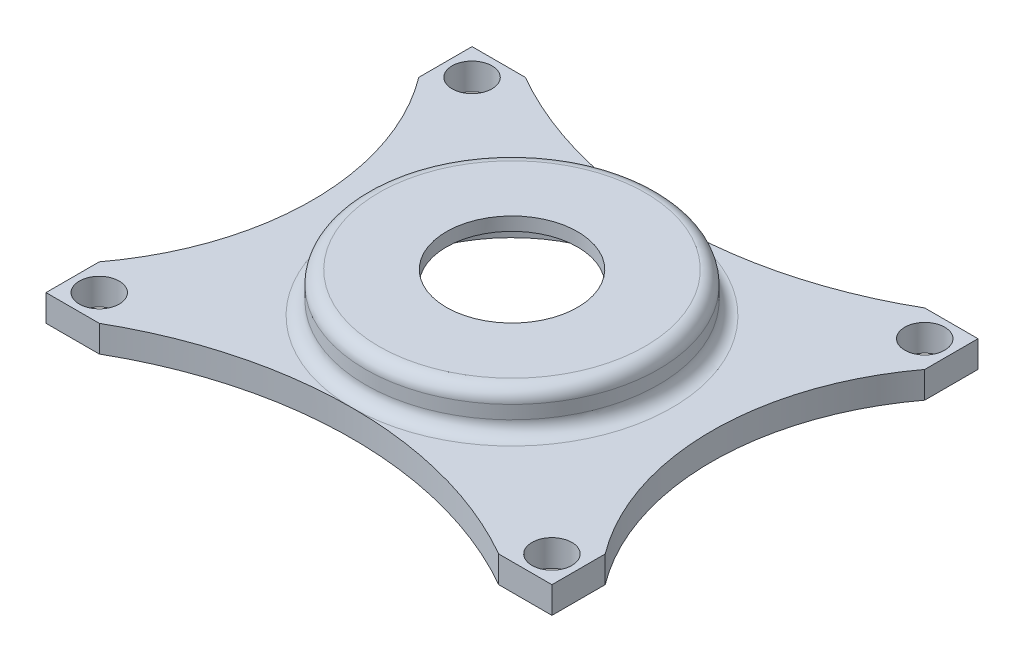
ISO-10303-21;
HEADER;
FILE_DESCRIPTION(('STEP AP214'),'2;1');
FILE_NAME('part.step','',(''),(''),'','','');
FILE_SCHEMA(('AUTOMOTIVE_DESIGN { 1 0 10303 214 1 1 1 1 }'));
ENDSEC;
DATA;
#1=APPLICATION_CONTEXT('core data for automotive mechanical design processes');
#2=APPLICATION_PROTOCOL_DEFINITION('international standard','automotive_design',2000,#1);
#3=PRODUCT_CONTEXT('',#1,'mechanical');
#4=PRODUCT('Part','Part','',(#3));
#5=PRODUCT_RELATED_PRODUCT_CATEGORY('part','',(#4));
#6=PRODUCT_DEFINITION_FORMATION('','',#4);
#7=PRODUCT_DEFINITION_CONTEXT('part definition',#1,'design');
#8=PRODUCT_DEFINITION('design','',#6,#7);
#9=PRODUCT_DEFINITION_SHAPE('','',#8);
#10=(LENGTH_UNIT() NAMED_UNIT(*) SI_UNIT(.MILLI.,.METRE.));
#11=(NAMED_UNIT(*) PLANE_ANGLE_UNIT() SI_UNIT($,.RADIAN.));
#12=(NAMED_UNIT(*) SI_UNIT($,.STERADIAN.) SOLID_ANGLE_UNIT());
#13=UNCERTAINTY_MEASURE_WITH_UNIT(LENGTH_MEASURE(1.E-05),#10,'distance_accuracy_value','');
#14=(GEOMETRIC_REPRESENTATION_CONTEXT(3) GLOBAL_UNCERTAINTY_ASSIGNED_CONTEXT((#13)) GLOBAL_UNIT_ASSIGNED_CONTEXT((#10,
#11,#12)) REPRESENTATION_CONTEXT('',''));
#15=CARTESIAN_POINT('',(0.,0.,0.));
#16=DIRECTION('',(0.,0.,1.));
#17=DIRECTION('',(1.,0.,0.));
#18=AXIS2_PLACEMENT_3D('',#15,#16,#17);
#19=CARTESIAN_POINT('',(0.,2.,0.));
#20=DIRECTION('',(0.,1.,0.));
#21=DIRECTION('',(0.,0.,1.));
#22=AXIS2_PLACEMENT_3D('',#19,#20,#21);
#23=CYLINDRICAL_SURFACE('',#22,4.92746606281714);
#24=CARTESIAN_POINT('',(0.,5.,0.));
#25=DIRECTION('',(0.,1.,0.));
#26=DIRECTION('',(0.,0.,1.));
#27=AXIS2_PLACEMENT_3D('',#24,#25,#26);
#28=CIRCLE('',#27,4.92746606281714);
#29=CARTESIAN_POINT('',(0.,5.,4.92746606281714));
#30=VERTEX_POINT('',#29);
#31=EDGE_CURVE('E170',#30,#30,#28,.T.);
#32=ORIENTED_EDGE('',*,*,#31,.T.);
#33=EDGE_LOOP('',(#32));
#34=FACE_BOUND('',#33,.T.);
#35=CARTESIAN_POINT('',(0.,4.,0.));
#36=DIRECTION('',(0.,-1.,0.));
#37=DIRECTION('',(0.,0.,-1.));
#38=AXIS2_PLACEMENT_3D('',#35,#36,#37);
#39=CIRCLE('',#38,4.92746606281714);
#40=CARTESIAN_POINT('',(0.,4.,-4.92746606281714));
#41=VERTEX_POINT('',#40);
#42=EDGE_CURVE('E168',#41,#41,#39,.F.);
#43=ORIENTED_EDGE('',*,*,#42,.F.);
#44=EDGE_LOOP('',(#43));
#45=FACE_BOUND('',#44,.T.);
#46=ADVANCED_FACE('F32',(#34,#45),#23,.F.);
#47=CARTESIAN_POINT('',(0.,3.,0.));
#48=DIRECTION('',(0.,-1.,0.));
#49=DIRECTION('',(0.,0.,-1.));
#50=AXIS2_PLACEMENT_3D('',#47,#48,#49);
#51=TOROIDAL_SURFACE('',#50,12.,1.);
#52=CARTESIAN_POINT('',(0.,3.,0.));
#53=DIRECTION('',(0.,-1.,0.));
#54=DIRECTION('',(0.,0.,-1.));
#55=AXIS2_PLACEMENT_3D('',#52,#53,#54);
#56=CIRCLE('',#55,11.);
#57=CARTESIAN_POINT('',(0.,3.,-11.));
#58=VERTEX_POINT('',#57);
#59=EDGE_CURVE('E162',#58,#58,#56,.F.);
#60=ORIENTED_EDGE('',*,*,#59,.F.);
#61=EDGE_LOOP('',(#60));
#62=FACE_BOUND('',#61,.T.);
#63=CARTESIAN_POINT('',(0.,2.,0.));
#64=DIRECTION('',(0.,-1.,0.));
#65=DIRECTION('',(0.,0.,-1.));
#66=AXIS2_PLACEMENT_3D('',#63,#64,#65);
#67=CIRCLE('',#66,12.);
#68=CARTESIAN_POINT('',(0.,2.,12.));
#69=VERTEX_POINT('',#68);
#70=CARTESIAN_POINT('',(0.,2.,-12.));
#71=VERTEX_POINT('',#70);
#72=EDGE_CURVE('E46',#69,#71,#67,.T.);
#73=ORIENTED_EDGE('',*,*,#72,.F.);
#74=CARTESIAN_POINT('',(0.,2.,0.));
#75=DIRECTION('',(0.,-1.,0.));
#76=DIRECTION('',(0.,0.,-1.));
#77=AXIS2_PLACEMENT_3D('',#74,#75,#76);
#78=CIRCLE('',#77,12.);
#79=EDGE_CURVE('E165',#71,#69,#78,.T.);
#80=ORIENTED_EDGE('',*,*,#79,.F.);
#81=EDGE_LOOP('',(#73,#80));
#82=FACE_BOUND('',#81,.T.);
#83=ADVANCED_FACE('F188',(#62,#82),#51,.F.);
#84=CARTESIAN_POINT('',(35.0000000000001,2.,0.));
#85=DIRECTION('',(0.,-1.,0.));
#86=DIRECTION('',(0.,0.,-1.));
#87=AXIS2_PLACEMENT_3D('',#84,#85,#86);
#88=PLANE('',#87);
#89=CARTESIAN_POINT('',(-17.,2.,-14.));
#90=DIRECTION('',(0.,1.,0.));
#91=DIRECTION('',(0.,0.,1.));
#92=AXIS2_PLACEMENT_3D('',#89,#90,#91);
#93=CIRCLE('',#92,1.5);
#94=CARTESIAN_POINT('',(-17.,2.,-12.5));
#95=VERTEX_POINT('',#94);
#96=EDGE_CURVE('E292',#95,#95,#93,.T.);
#97=ORIENTED_EDGE('',*,*,#96,.F.);
#98=EDGE_LOOP('',(#97));
#99=FACE_BOUND('',#98,.T.);
#100=CARTESIAN_POINT('',(-17.,2.,14.));
#101=DIRECTION('',(0.,1.,0.));
#102=DIRECTION('',(0.,0.,1.));
#103=AXIS2_PLACEMENT_3D('',#100,#101,#102);
#104=CIRCLE('',#103,1.5);
#105=CARTESIAN_POINT('',(-17.,2.,15.5));
#106=VERTEX_POINT('',#105);
#107=EDGE_CURVE('E295',#106,#106,#104,.T.);
#108=ORIENTED_EDGE('',*,*,#107,.F.);
#109=EDGE_LOOP('',(#108));
#110=FACE_BOUND('',#109,.T.);
#111=CARTESIAN_POINT('',(0.,2.,42.1250000000001));
#112=DIRECTION('',(0.,-1.,0.));
#113=DIRECTION('',(0.,0.,-1.));
#114=AXIS2_PLACEMENT_3D('',#111,#112,#113);
#115=CIRCLE('',#114,30.1250000000001);
#116=CARTESIAN_POINT('',(-15.,2.,16.));
#117=VERTEX_POINT('',#116);
#118=EDGE_CURVE('E297',#117,#69,#115,.T.);
#119=ORIENTED_EDGE('',*,*,#118,.T.);
#120=ORIENTED_EDGE('',*,*,#72,.T.);
#121=CARTESIAN_POINT('',(0.,2.,-42.1250000000001));
#122=DIRECTION('',(0.,-1.,0.));
#123=DIRECTION('',(0.,0.,-1.));
#124=AXIS2_PLACEMENT_3D('',#121,#122,#123);
#125=CIRCLE('',#124,30.1250000000001);
#126=CARTESIAN_POINT('',(-15.,2.,-16.));
#127=VERTEX_POINT('',#126);
#128=EDGE_CURVE('E370',#71,#127,#125,.T.);
#129=ORIENTED_EDGE('',*,*,#128,.T.);
#130=DIRECTION('',(-1.,0.,0.));
#131=VECTOR('',#130,1.);
#132=CARTESIAN_POINT('',(-19.,2.,-16.));
#133=LINE('',#132,#131);
#134=CARTESIAN_POINT('',(-19.,2.,-16.));
#135=VERTEX_POINT('',#134);
#136=EDGE_CURVE('E371',#127,#135,#133,.T.);
#137=ORIENTED_EDGE('',*,*,#136,.T.);
#138=DIRECTION('',(0.,0.,1.));
#139=VECTOR('',#138,1.);
#140=CARTESIAN_POINT('',(-19.,2.,-16.));
#141=LINE('',#140,#139);
#142=CARTESIAN_POINT('',(-19.,2.,-12.));
#143=VERTEX_POINT('',#142);
#144=EDGE_CURVE('E373',#135,#143,#141,.T.);
#145=ORIENTED_EDGE('',*,*,#144,.T.);
#146=CARTESIAN_POINT('',(-35.,2.,0.));
#147=DIRECTION('',(0.,-1.,0.));
#148=DIRECTION('',(0.,0.,-1.));
#149=AXIS2_PLACEMENT_3D('',#146,#147,#148);
#150=CIRCLE('',#149,20.);
#151=CARTESIAN_POINT('',(-19.,2.,12.));
#152=VERTEX_POINT('',#151);
#153=EDGE_CURVE('E380',#143,#152,#150,.T.);
#154=ORIENTED_EDGE('',*,*,#153,.T.);
#155=DIRECTION('',(0.,0.,1.));
#156=VECTOR('',#155,1.);
#157=CARTESIAN_POINT('',(-19.,2.,12.));
#158=LINE('',#157,#156);
#159=CARTESIAN_POINT('',(-19.,2.,16.));
#160=VERTEX_POINT('',#159);
#161=EDGE_CURVE('E381',#152,#160,#158,.T.);
#162=ORIENTED_EDGE('',*,*,#161,.T.);
#163=DIRECTION('',(1.,0.,0.));
#164=VECTOR('',#163,1.);
#165=CARTESIAN_POINT('',(-19.,2.,16.));
#166=LINE('',#165,#164);
#167=EDGE_CURVE('E299',#160,#117,#166,.T.);
#168=ORIENTED_EDGE('',*,*,#167,.T.);
#169=EDGE_LOOP('',(#119,#120,#129,#137,#145,#154,#162,#168));
#170=FACE_BOUND('',#169,.T.);
#171=ADVANCED_FACE('F194',(#99,#110,#170),#88,.F.);
#172=CARTESIAN_POINT('',(0.,4.,0.));
#173=DIRECTION('',(0.,1.,0.));
#174=DIRECTION('',(0.,0.,1.));
#175=AXIS2_PLACEMENT_3D('',#172,#173,#174);
#176=TOROIDAL_SURFACE('',#175,10.,1.);
#177=CARTESIAN_POINT('',(0.,5.,0.));
#178=DIRECTION('',(0.,1.,0.));
#179=DIRECTION('',(0.,0.,1.));
#180=AXIS2_PLACEMENT_3D('',#177,#178,#179);
#181=CIRCLE('',#180,10.);
#182=CARTESIAN_POINT('',(0.,5.,10.));
#183=VERTEX_POINT('',#182);
#184=EDGE_CURVE('E151',#183,#183,#181,.T.);
#185=ORIENTED_EDGE('',*,*,#184,.F.);
#186=EDGE_LOOP('',(#185));
#187=FACE_BOUND('',#186,.T.);
#188=CARTESIAN_POINT('',(0.,4.,0.));
#189=DIRECTION('',(0.,1.,0.));
#190=DIRECTION('',(0.,0.,1.));
#191=AXIS2_PLACEMENT_3D('',#188,#189,#190);
#192=CIRCLE('',#191,11.);
#193=CARTESIAN_POINT('',(0.,4.,11.));
#194=VERTEX_POINT('',#193);
#195=EDGE_CURVE('E154',#194,#194,#192,.F.);
#196=ORIENTED_EDGE('',*,*,#195,.F.);
#197=EDGE_LOOP('',(#196));
#198=FACE_BOUND('',#197,.T.);
#199=ADVANCED_FACE('F275',(#187,#198),#176,.T.);
#200=CARTESIAN_POINT('',(15.,2.,16.));
#201=DIRECTION('',(0.,0.,-1.));
#202=DIRECTION('',(-1.,0.,0.));
#203=AXIS2_PLACEMENT_3D('',#200,#201,#202);
#204=PLANE('',#203);
#205=DIRECTION('',(1.,0.,0.));
#206=VECTOR('',#205,1.);
#207=CARTESIAN_POINT('',(15.,0.,16.));
#208=LINE('',#207,#206);
#209=CARTESIAN_POINT('',(15.,0.,16.));
#210=VERTEX_POINT('',#209);
#211=CARTESIAN_POINT('',(19.,0.,16.));
#212=VERTEX_POINT('',#211);
#213=EDGE_CURVE('E150',#210,#212,#208,.T.);
#214=ORIENTED_EDGE('',*,*,#213,.T.);
#215=DIRECTION('',(0.,-1.,0.));
#216=VECTOR('',#215,1.);
#217=CARTESIAN_POINT('',(19.,2.,16.));
#218=LINE('',#217,#216);
#219=CARTESIAN_POINT('',(19.,2.,16.));
#220=VERTEX_POINT('',#219);
#221=EDGE_CURVE('E129',#220,#212,#218,.T.);
#222=ORIENTED_EDGE('',*,*,#221,.F.);
#223=DIRECTION('',(1.,0.,0.));
#224=VECTOR('',#223,1.);
#225=CARTESIAN_POINT('',(15.,2.,16.));
#226=LINE('',#225,#224);
#227=CARTESIAN_POINT('',(15.,2.,16.));
#228=VERTEX_POINT('',#227);
#229=EDGE_CURVE('E136',#228,#220,#226,.T.);
#230=ORIENTED_EDGE('',*,*,#229,.F.);
#231=DIRECTION('',(0.,-1.,0.));
#232=VECTOR('',#231,1.);
#233=CARTESIAN_POINT('',(15.,2.,16.));
#234=LINE('',#233,#232);
#235=EDGE_CURVE('E302',#228,#210,#234,.T.);
#236=ORIENTED_EDGE('',*,*,#235,.T.);
#237=EDGE_LOOP('',(#214,#222,#230,#236));
#238=FACE_BOUND('',#237,.T.);
#239=ADVANCED_FACE('F148',(#238),#204,.F.);
#240=CARTESIAN_POINT('',(19.,2.,12.));
#241=DIRECTION('',(-1.,0.,0.));
#242=DIRECTION('',(0.,0.,1.));
#243=AXIS2_PLACEMENT_3D('',#240,#241,#242);
#244=PLANE('',#243);
#245=DIRECTION('',(0.,0.,-1.));
#246=VECTOR('',#245,1.);
#247=CARTESIAN_POINT('',(19.,0.,12.));
#248=LINE('',#247,#246);
#249=CARTESIAN_POINT('',(19.,0.,12.));
#250=VERTEX_POINT('',#249);
#251=EDGE_CURVE('E310',#212,#250,#248,.T.);
#252=ORIENTED_EDGE('',*,*,#251,.T.);
#253=DIRECTION('',(0.,-1.,0.));
#254=VECTOR('',#253,1.);
#255=CARTESIAN_POINT('',(19.,2.,12.));
#256=LINE('',#255,#254);
#257=CARTESIAN_POINT('',(19.,2.,12.));
#258=VERTEX_POINT('',#257);
#259=EDGE_CURVE('E132',#258,#250,#256,.T.);
#260=ORIENTED_EDGE('',*,*,#259,.F.);
#261=DIRECTION('',(0.,0.,-1.));
#262=VECTOR('',#261,1.);
#263=CARTESIAN_POINT('',(19.,2.,12.));
#264=LINE('',#263,#262);
#265=EDGE_CURVE('E125',#220,#258,#264,.T.);
#266=ORIENTED_EDGE('',*,*,#265,.F.);
#267=ORIENTED_EDGE('',*,*,#221,.T.);
#268=EDGE_LOOP('',(#252,#260,#266,#267));
#269=FACE_BOUND('',#268,.T.);
#270=ADVANCED_FACE('F127',(#269),#244,.F.);
#271=CARTESIAN_POINT('',(35.0000000000001,2.,0.));
#272=DIRECTION('',(0.,-1.,0.));
#273=DIRECTION('',(0.,0.,-1.));
#274=AXIS2_PLACEMENT_3D('',#271,#272,#273);
#275=CYLINDRICAL_SURFACE('',#274,20.0000000000001);
#276=CARTESIAN_POINT('',(35.0000000000001,0.,0.));
#277=DIRECTION('',(0.,-1.,0.));
#278=DIRECTION('',(0.,0.,-1.));
#279=AXIS2_PLACEMENT_3D('',#276,#277,#278);
#280=CIRCLE('',#279,20.0000000000001);
#281=CARTESIAN_POINT('',(19.,0.,-12.));
#282=VERTEX_POINT('',#281);
#283=EDGE_CURVE('E313',#250,#282,#280,.T.);
#284=ORIENTED_EDGE('',*,*,#283,.T.);
#285=DIRECTION('',(0.,-1.,0.));
#286=VECTOR('',#285,1.);
#287=CARTESIAN_POINT('',(19.,2.,-12.));
#288=LINE('',#287,#286);
#289=CARTESIAN_POINT('',(19.,2.,-12.));
#290=VERTEX_POINT('',#289);
#291=EDGE_CURVE('E156',#290,#282,#288,.T.);
#292=ORIENTED_EDGE('',*,*,#291,.F.);
#293=CARTESIAN_POINT('',(35.0000000000001,2.,0.));
#294=DIRECTION('',(0.,-1.,0.));
#295=DIRECTION('',(0.,0.,-1.));
#296=AXIS2_PLACEMENT_3D('',#293,#294,#295);
#297=CIRCLE('',#296,20.0000000000001);
#298=EDGE_CURVE('E135',#258,#290,#297,.T.);
#299=ORIENTED_EDGE('',*,*,#298,.F.);
#300=ORIENTED_EDGE('',*,*,#259,.T.);
#301=EDGE_LOOP('',(#284,#292,#299,#300));
#302=FACE_BOUND('',#301,.T.);
#303=ADVANCED_FACE('F266',(#302),#275,.F.);
#304=CARTESIAN_POINT('',(19.,2.,-16.));
#305=DIRECTION('',(-1.,0.,0.));
#306=DIRECTION('',(0.,0.,1.));
#307=AXIS2_PLACEMENT_3D('',#304,#305,#306);
#308=PLANE('',#307);
#309=DIRECTION('',(0.,0.,-1.));
#310=VECTOR('',#309,1.);
#311=CARTESIAN_POINT('',(19.,0.,-16.));
#312=LINE('',#311,#310);
#313=CARTESIAN_POINT('',(19.,0.,-16.));
#314=VERTEX_POINT('',#313);
#315=EDGE_CURVE('E315',#282,#314,#312,.T.);
#316=ORIENTED_EDGE('',*,*,#315,.T.);
#317=DIRECTION('',(0.,-1.,0.));
#318=VECTOR('',#317,1.);
#319=CARTESIAN_POINT('',(19.,2.,-16.));
#320=LINE('',#319,#318);
#321=CARTESIAN_POINT('',(19.,2.,-16.));
#322=VERTEX_POINT('',#321);
#323=EDGE_CURVE('E351',#322,#314,#320,.T.);
#324=ORIENTED_EDGE('',*,*,#323,.F.);
#325=DIRECTION('',(0.,0.,-1.));
#326=VECTOR('',#325,1.);
#327=CARTESIAN_POINT('',(19.,2.,-16.));
#328=LINE('',#327,#326);
#329=EDGE_CURVE('E358',#290,#322,#328,.T.);
#330=ORIENTED_EDGE('',*,*,#329,.F.);
#331=ORIENTED_EDGE('',*,*,#291,.T.);
#332=EDGE_LOOP('',(#316,#324,#330,#331));
#333=FACE_BOUND('',#332,.T.);
#334=ADVANCED_FACE('F262',(#333),#308,.F.);
#335=CARTESIAN_POINT('',(15.,2.,-16.));
#336=DIRECTION('',(0.,0.,1.));
#337=DIRECTION('',(1.,0.,0.));
#338=AXIS2_PLACEMENT_3D('',#335,#336,#337);
#339=PLANE('',#338);
#340=DIRECTION('',(-1.,0.,0.));
#341=VECTOR('',#340,1.);
#342=CARTESIAN_POINT('',(15.,0.,-16.));
#343=LINE('',#342,#341);
#344=CARTESIAN_POINT('',(15.,0.,-16.));
#345=VERTEX_POINT('',#344);
#346=EDGE_CURVE('E317',#314,#345,#343,.T.);
#347=ORIENTED_EDGE('',*,*,#346,.T.);
#348=DIRECTION('',(0.,-1.,0.));
#349=VECTOR('',#348,1.);
#350=CARTESIAN_POINT('',(15.,2.,-16.));
#351=LINE('',#350,#349);
#352=CARTESIAN_POINT('',(15.,2.,-16.));
#353=VERTEX_POINT('',#352);
#354=EDGE_CURVE('E348',#353,#345,#351,.T.);
#355=ORIENTED_EDGE('',*,*,#354,.F.);
#356=DIRECTION('',(-1.,0.,0.));
#357=VECTOR('',#356,1.);
#358=CARTESIAN_POINT('',(15.,2.,-16.));
#359=LINE('',#358,#357);
#360=EDGE_CURVE('E375',#322,#353,#359,.T.);
#361=ORIENTED_EDGE('',*,*,#360,.F.);
#362=ORIENTED_EDGE('',*,*,#323,.T.);
#363=EDGE_LOOP('',(#347,#355,#361,#362));
#364=FACE_BOUND('',#363,.T.);
#365=ADVANCED_FACE('F258',(#364),#339,.F.);
#366=CARTESIAN_POINT('',(0.,2.,-42.1250000000001));
#367=DIRECTION('',(0.,-1.,0.));
#368=DIRECTION('',(0.,0.,-1.));
#369=AXIS2_PLACEMENT_3D('',#366,#367,#368);
#370=CYLINDRICAL_SURFACE('',#369,30.1250000000001);
#371=CARTESIAN_POINT('',(0.,0.,-42.1250000000001));
#372=DIRECTION('',(0.,-1.,0.));
#373=DIRECTION('',(0.,0.,-1.));
#374=AXIS2_PLACEMENT_3D('',#371,#372,#373);
#375=CIRCLE('',#374,30.1250000000001);
#376=CARTESIAN_POINT('',(-15.,0.,-16.));
#377=VERTEX_POINT('',#376);
#378=EDGE_CURVE('E319',#345,#377,#375,.T.);
#379=ORIENTED_EDGE('',*,*,#378,.T.);
#380=DIRECTION('',(0.,-1.,0.));
#381=VECTOR('',#380,1.);
#382=CARTESIAN_POINT('',(-15.,2.,-16.));
#383=LINE('',#382,#381);
#384=EDGE_CURVE('E345',#127,#377,#383,.T.);
#385=ORIENTED_EDGE('',*,*,#384,.F.);
#386=ORIENTED_EDGE('',*,*,#128,.F.);
#387=EDGE_CURVE('E369',#353,#71,#125,.T.);
#388=ORIENTED_EDGE('',*,*,#387,.F.);
#389=ORIENTED_EDGE('',*,*,#354,.T.);
#390=EDGE_LOOP('',(#379,#385,#386,#388,#389));
#391=FACE_BOUND('',#390,.T.);
#392=ADVANCED_FACE('F254',(#391),#370,.F.);
#393=CARTESIAN_POINT('',(-19.,2.,-16.));
#394=DIRECTION('',(0.,0.,1.));
#395=DIRECTION('',(1.,0.,0.));
#396=AXIS2_PLACEMENT_3D('',#393,#394,#395);
#397=PLANE('',#396);
#398=DIRECTION('',(-1.,0.,0.));
#399=VECTOR('',#398,1.);
#400=CARTESIAN_POINT('',(-19.,0.,-16.));
#401=LINE('',#400,#399);
#402=CARTESIAN_POINT('',(-19.,0.,-16.));
#403=VERTEX_POINT('',#402);
#404=EDGE_CURVE('E321',#377,#403,#401,.T.);
#405=ORIENTED_EDGE('',*,*,#404,.T.);
#406=DIRECTION('',(0.,-1.,0.));
#407=VECTOR('',#406,1.);
#408=CARTESIAN_POINT('',(-19.,2.,-16.));
#409=LINE('',#408,#407);
#410=EDGE_CURVE('E342',#135,#403,#409,.T.);
#411=ORIENTED_EDGE('',*,*,#410,.F.);
#412=ORIENTED_EDGE('',*,*,#136,.F.);
#413=ORIENTED_EDGE('',*,*,#384,.T.);
#414=EDGE_LOOP('',(#405,#411,#412,#413));
#415=FACE_BOUND('',#414,.T.);
#416=ADVANCED_FACE('F250',(#415),#397,.F.);
#417=CARTESIAN_POINT('',(-19.,2.,-16.));
#418=DIRECTION('',(1.,0.,0.));
#419=DIRECTION('',(0.,0.,-1.));
#420=AXIS2_PLACEMENT_3D('',#417,#418,#419);
#421=PLANE('',#420);
#422=DIRECTION('',(0.,0.,1.));
#423=VECTOR('',#422,1.);
#424=CARTESIAN_POINT('',(-19.,0.,-16.));
#425=LINE('',#424,#423);
#426=CARTESIAN_POINT('',(-19.,0.,-12.));
#427=VERTEX_POINT('',#426);
#428=EDGE_CURVE('E323',#403,#427,#425,.T.);
#429=ORIENTED_EDGE('',*,*,#428,.T.);
#430=DIRECTION('',(0.,-1.,0.));
#431=VECTOR('',#430,1.);
#432=CARTESIAN_POINT('',(-19.,2.,-12.));
#433=LINE('',#432,#431);
#434=EDGE_CURVE('E339',#143,#427,#433,.T.);
#435=ORIENTED_EDGE('',*,*,#434,.F.);
#436=ORIENTED_EDGE('',*,*,#144,.F.);
#437=ORIENTED_EDGE('',*,*,#410,.T.);
#438=EDGE_LOOP('',(#429,#435,#436,#437));
#439=FACE_BOUND('',#438,.T.);
#440=ADVANCED_FACE('F246',(#439),#421,.F.);
#441=CARTESIAN_POINT('',(-35.,2.,0.));
#442=DIRECTION('',(0.,-1.,0.));
#443=DIRECTION('',(0.,0.,-1.));
#444=AXIS2_PLACEMENT_3D('',#441,#442,#443);
#445=CYLINDRICAL_SURFACE('',#444,20.);
#446=CARTESIAN_POINT('',(-35.,0.,0.));
#447=DIRECTION('',(0.,-1.,0.));
#448=DIRECTION('',(0.,0.,-1.));
#449=AXIS2_PLACEMENT_3D('',#446,#447,#448);
#450=CIRCLE('',#449,20.);
#451=CARTESIAN_POINT('',(-19.,0.,12.));
#452=VERTEX_POINT('',#451);
#453=EDGE_CURVE('E325',#427,#452,#450,.T.);
#454=ORIENTED_EDGE('',*,*,#453,.T.);
#455=DIRECTION('',(0.,-1.,0.));
#456=VECTOR('',#455,1.);
#457=CARTESIAN_POINT('',(-19.,2.,12.));
#458=LINE('',#457,#456);
#459=EDGE_CURVE('E336',#152,#452,#458,.T.);
#460=ORIENTED_EDGE('',*,*,#459,.F.);
#461=ORIENTED_EDGE('',*,*,#153,.F.);
#462=ORIENTED_EDGE('',*,*,#434,.T.);
#463=EDGE_LOOP('',(#454,#460,#461,#462));
#464=FACE_BOUND('',#463,.T.);
#465=ADVANCED_FACE('F242',(#464),#445,.F.);
#466=CARTESIAN_POINT('',(-19.,2.,12.));
#467=DIRECTION('',(1.,0.,0.));
#468=DIRECTION('',(0.,0.,-1.));
#469=AXIS2_PLACEMENT_3D('',#466,#467,#468);
#470=PLANE('',#469);
#471=DIRECTION('',(0.,0.,1.));
#472=VECTOR('',#471,1.);
#473=CARTESIAN_POINT('',(-19.,0.,12.));
#474=LINE('',#473,#472);
#475=CARTESIAN_POINT('',(-19.,0.,16.));
#476=VERTEX_POINT('',#475);
#477=EDGE_CURVE('E327',#452,#476,#474,.T.);
#478=ORIENTED_EDGE('',*,*,#477,.T.);
#479=DIRECTION('',(0.,-1.,0.));
#480=VECTOR('',#479,1.);
#481=CARTESIAN_POINT('',(-19.,2.,16.));
#482=LINE('',#481,#480);
#483=EDGE_CURVE('E333',#160,#476,#482,.T.);
#484=ORIENTED_EDGE('',*,*,#483,.F.);
#485=ORIENTED_EDGE('',*,*,#161,.F.);
#486=ORIENTED_EDGE('',*,*,#459,.T.);
#487=EDGE_LOOP('',(#478,#484,#485,#486));
#488=FACE_BOUND('',#487,.T.);
#489=ADVANCED_FACE('F238',(#488),#470,.F.);
#490=CARTESIAN_POINT('',(-19.,2.,16.));
#491=DIRECTION('',(0.,0.,-1.));
#492=DIRECTION('',(-1.,0.,0.));
#493=AXIS2_PLACEMENT_3D('',#490,#491,#492);
#494=PLANE('',#493);
#495=DIRECTION('',(1.,0.,0.));
#496=VECTOR('',#495,1.);
#497=CARTESIAN_POINT('',(-19.,0.,16.));
#498=LINE('',#497,#496);
#499=CARTESIAN_POINT('',(-15.,0.,16.));
#500=VERTEX_POINT('',#499);
#501=EDGE_CURVE('E329',#476,#500,#498,.T.);
#502=ORIENTED_EDGE('',*,*,#501,.T.);
#503=DIRECTION('',(0.,-1.,0.));
#504=VECTOR('',#503,1.);
#505=CARTESIAN_POINT('',(-15.,2.,16.));
#506=LINE('',#505,#504);
#507=EDGE_CURVE('E304',#117,#500,#506,.T.);
#508=ORIENTED_EDGE('',*,*,#507,.F.);
#509=ORIENTED_EDGE('',*,*,#167,.F.);
#510=ORIENTED_EDGE('',*,*,#483,.T.);
#511=EDGE_LOOP('',(#502,#508,#509,#510));
#512=FACE_BOUND('',#511,.T.);
#513=ADVANCED_FACE('F234',(#512),#494,.F.);
#514=CARTESIAN_POINT('',(0.,2.,42.1250000000001));
#515=DIRECTION('',(0.,-1.,0.));
#516=DIRECTION('',(0.,0.,-1.));
#517=AXIS2_PLACEMENT_3D('',#514,#515,#516);
#518=CYLINDRICAL_SURFACE('',#517,30.1250000000001);
#519=CARTESIAN_POINT('',(0.,0.,42.1250000000001));
#520=DIRECTION('',(0.,-1.,0.));
#521=DIRECTION('',(0.,0.,-1.));
#522=AXIS2_PLACEMENT_3D('',#519,#520,#521);
#523=CIRCLE('',#522,30.1250000000001);
#524=EDGE_CURVE('E146',#500,#210,#523,.T.);
#525=ORIENTED_EDGE('',*,*,#524,.T.);
#526=ORIENTED_EDGE('',*,*,#235,.F.);
#527=EDGE_CURVE('E142',#69,#228,#115,.T.);
#528=ORIENTED_EDGE('',*,*,#527,.F.);
#529=ORIENTED_EDGE('',*,*,#118,.F.);
#530=ORIENTED_EDGE('',*,*,#507,.T.);
#531=EDGE_LOOP('',(#525,#526,#528,#529,#530));
#532=FACE_BOUND('',#531,.T.);
#533=ADVANCED_FACE('F227',(#532),#518,.F.);
#534=CARTESIAN_POINT('',(17.,2.,-14.));
#535=DIRECTION('',(0.,1.,0.));
#536=DIRECTION('',(0.,0.,1.));
#537=AXIS2_PLACEMENT_3D('',#534,#535,#536);
#538=CIRCLE('',#537,1.5);
#539=CARTESIAN_POINT('',(17.,2.,-12.5));
#540=VERTEX_POINT('',#539);
#541=EDGE_CURVE('E405',#540,#540,#538,.T.);
#542=ORIENTED_EDGE('',*,*,#541,.F.);
#543=EDGE_LOOP('',(#542));
#544=FACE_BOUND('',#543,.T.);
#545=CARTESIAN_POINT('',(17.,2.,14.));
#546=DIRECTION('',(0.,1.,0.));
#547=DIRECTION('',(0.,0.,1.));
#548=AXIS2_PLACEMENT_3D('',#545,#546,#547);
#549=CIRCLE('',#548,1.5);
#550=CARTESIAN_POINT('',(17.,2.,15.5));
#551=VERTEX_POINT('',#550);
#552=EDGE_CURVE('E399',#551,#551,#549,.T.);
#553=ORIENTED_EDGE('',*,*,#552,.F.);
#554=EDGE_LOOP('',(#553));
#555=FACE_BOUND('',#554,.T.);
#556=ORIENTED_EDGE('',*,*,#387,.T.);
#557=ORIENTED_EDGE('',*,*,#79,.T.);
#558=ORIENTED_EDGE('',*,*,#527,.T.);
#559=ORIENTED_EDGE('',*,*,#229,.T.);
#560=ORIENTED_EDGE('',*,*,#265,.T.);
#561=ORIENTED_EDGE('',*,*,#298,.T.);
#562=ORIENTED_EDGE('',*,*,#329,.T.);
#563=ORIENTED_EDGE('',*,*,#360,.T.);
#564=EDGE_LOOP('',(#556,#557,#558,#559,#560,#561,#562,#563));
#565=FACE_BOUND('',#564,.T.);
#566=ADVANCED_FACE('F140',(#544,#555,#565),#88,.F.);
#567=CARTESIAN_POINT('',(35.0000000000001,0.,0.));
#568=DIRECTION('',(0.,-1.,0.));
#569=DIRECTION('',(0.,0.,-1.));
#570=AXIS2_PLACEMENT_3D('',#567,#568,#569);
#571=PLANE('',#570);
#572=CARTESIAN_POINT('',(0.,0.,0.));
#573=DIRECTION('',(0.,-1.,0.));
#574=DIRECTION('',(0.,0.,-1.));
#575=AXIS2_PLACEMENT_3D('',#572,#573,#574);
#576=CIRCLE('',#575,10.);
#577=CARTESIAN_POINT('',(0.,0.,-10.));
#578=VERTEX_POINT('',#577);
#579=EDGE_CURVE('E171',#578,#578,#576,.T.);
#580=ORIENTED_EDGE('',*,*,#579,.F.);
#581=EDGE_LOOP('',(#580));
#582=FACE_BOUND('',#581,.T.);
#583=CARTESIAN_POINT('',(17.,0.,-14.));
#584=DIRECTION('',(0.,1.,0.));
#585=DIRECTION('',(0.,0.,1.));
#586=AXIS2_PLACEMENT_3D('',#583,#584,#585);
#587=CIRCLE('',#586,1.5);
#588=CARTESIAN_POINT('',(17.,0.,-12.5));
#589=VERTEX_POINT('',#588);
#590=EDGE_CURVE('E392',#589,#589,#587,.T.);
#591=ORIENTED_EDGE('',*,*,#590,.T.);
#592=EDGE_LOOP('',(#591));
#593=FACE_BOUND('',#592,.T.);
#594=CARTESIAN_POINT('',(17.,0.,14.));
#595=DIRECTION('',(0.,1.,0.));
#596=DIRECTION('',(0.,0.,1.));
#597=AXIS2_PLACEMENT_3D('',#594,#595,#596);
#598=CIRCLE('',#597,1.5);
#599=CARTESIAN_POINT('',(17.,0.,15.5));
#600=VERTEX_POINT('',#599);
#601=EDGE_CURVE('E402',#600,#600,#598,.T.);
#602=ORIENTED_EDGE('',*,*,#601,.T.);
#603=EDGE_LOOP('',(#602));
#604=FACE_BOUND('',#603,.T.);
#605=CARTESIAN_POINT('',(-17.,0.,14.));
#606=DIRECTION('',(0.,1.,0.));
#607=DIRECTION('',(0.,0.,1.));
#608=AXIS2_PLACEMENT_3D('',#605,#606,#607);
#609=CIRCLE('',#608,1.5);
#610=CARTESIAN_POINT('',(-17.,0.,15.5));
#611=VERTEX_POINT('',#610);
#612=EDGE_CURVE('E396',#611,#611,#609,.T.);
#613=ORIENTED_EDGE('',*,*,#612,.T.);
#614=EDGE_LOOP('',(#613));
#615=FACE_BOUND('',#614,.T.);
#616=CARTESIAN_POINT('',(-17.,0.,-14.));
#617=DIRECTION('',(0.,1.,0.));
#618=DIRECTION('',(0.,0.,1.));
#619=AXIS2_PLACEMENT_3D('',#616,#617,#618);
#620=CIRCLE('',#619,1.5);
#621=CARTESIAN_POINT('',(-17.,0.,-12.5));
#622=VERTEX_POINT('',#621);
#623=EDGE_CURVE('E311',#622,#622,#620,.T.);
#624=ORIENTED_EDGE('',*,*,#623,.T.);
#625=EDGE_LOOP('',(#624));
#626=FACE_BOUND('',#625,.T.);
#627=ORIENTED_EDGE('',*,*,#213,.F.);
#628=ORIENTED_EDGE('',*,*,#524,.F.);
#629=ORIENTED_EDGE('',*,*,#501,.F.);
#630=ORIENTED_EDGE('',*,*,#477,.F.);
#631=ORIENTED_EDGE('',*,*,#453,.F.);
#632=ORIENTED_EDGE('',*,*,#428,.F.);
#633=ORIENTED_EDGE('',*,*,#404,.F.);
#634=ORIENTED_EDGE('',*,*,#378,.F.);
#635=ORIENTED_EDGE('',*,*,#346,.F.);
#636=ORIENTED_EDGE('',*,*,#315,.F.);
#637=ORIENTED_EDGE('',*,*,#283,.F.);
#638=ORIENTED_EDGE('',*,*,#251,.F.);
#639=EDGE_LOOP('',(#627,#628,#629,#630,#631,#632,#633,#634,#635,#636,#637,#638));
#640=FACE_BOUND('',#639,.T.);
#641=ADVANCED_FACE('F223',(#582,#593,#604,#615,#626,#640),#571,.T.);
#642=CARTESIAN_POINT('',(-17.,0.,-14.));
#643=DIRECTION('',(0.,1.,0.));
#644=DIRECTION('',(0.,0.,1.));
#645=AXIS2_PLACEMENT_3D('',#642,#643,#644);
#646=CYLINDRICAL_SURFACE('',#645,1.5);
#647=ORIENTED_EDGE('',*,*,#623,.F.);
#648=EDGE_LOOP('',(#647));
#649=FACE_BOUND('',#648,.T.);
#650=ORIENTED_EDGE('',*,*,#96,.T.);
#651=EDGE_LOOP('',(#650));
#652=FACE_BOUND('',#651,.T.);
#653=ADVANCED_FACE('F219',(#649,#652),#646,.F.);
#654=CARTESIAN_POINT('',(-17.,0.,14.));
#655=DIRECTION('',(0.,1.,0.));
#656=DIRECTION('',(0.,0.,1.));
#657=AXIS2_PLACEMENT_3D('',#654,#655,#656);
#658=CYLINDRICAL_SURFACE('',#657,1.5);
#659=ORIENTED_EDGE('',*,*,#612,.F.);
#660=EDGE_LOOP('',(#659));
#661=FACE_BOUND('',#660,.T.);
#662=ORIENTED_EDGE('',*,*,#107,.T.);
#663=EDGE_LOOP('',(#662));
#664=FACE_BOUND('',#663,.T.);
#665=ADVANCED_FACE('F215',(#661,#664),#658,.F.);
#666=CARTESIAN_POINT('',(17.,0.,14.));
#667=DIRECTION('',(0.,1.,0.));
#668=DIRECTION('',(0.,0.,1.));
#669=AXIS2_PLACEMENT_3D('',#666,#667,#668);
#670=CYLINDRICAL_SURFACE('',#669,1.5);
#671=ORIENTED_EDGE('',*,*,#601,.F.);
#672=EDGE_LOOP('',(#671));
#673=FACE_BOUND('',#672,.T.);
#674=ORIENTED_EDGE('',*,*,#552,.T.);
#675=EDGE_LOOP('',(#674));
#676=FACE_BOUND('',#675,.T.);
#677=ADVANCED_FACE('F211',(#673,#676),#670,.F.);
#678=CARTESIAN_POINT('',(17.,0.,-14.));
#679=DIRECTION('',(0.,1.,0.));
#680=DIRECTION('',(0.,0.,1.));
#681=AXIS2_PLACEMENT_3D('',#678,#679,#680);
#682=CYLINDRICAL_SURFACE('',#681,1.5);
#683=ORIENTED_EDGE('',*,*,#590,.F.);
#684=EDGE_LOOP('',(#683));
#685=FACE_BOUND('',#684,.T.);
#686=ORIENTED_EDGE('',*,*,#541,.T.);
#687=EDGE_LOOP('',(#686));
#688=FACE_BOUND('',#687,.T.);
#689=ADVANCED_FACE('F207',(#685,#688),#682,.F.);
#690=CARTESIAN_POINT('',(0.,5.,0.));
#691=DIRECTION('',(0.,-1.,0.));
#692=DIRECTION('',(0.,0.,-1.));
#693=AXIS2_PLACEMENT_3D('',#690,#691,#692);
#694=CYLINDRICAL_SURFACE('',#693,11.);
#695=ORIENTED_EDGE('',*,*,#59,.T.);
#696=EDGE_LOOP('',(#695));
#697=FACE_BOUND('',#696,.T.);
#698=ORIENTED_EDGE('',*,*,#195,.T.);
#699=EDGE_LOOP('',(#698));
#700=FACE_BOUND('',#699,.T.);
#701=ADVANCED_FACE('F203',(#697,#700),#694,.T.);
#702=CARTESIAN_POINT('',(0.,5.,0.));
#703=DIRECTION('',(0.,1.,0.));
#704=DIRECTION('',(0.,0.,1.));
#705=AXIS2_PLACEMENT_3D('',#702,#703,#704);
#706=PLANE('',#705);
#707=ORIENTED_EDGE('',*,*,#31,.F.);
#708=EDGE_LOOP('',(#707));
#709=FACE_BOUND('',#708,.T.);
#710=ORIENTED_EDGE('',*,*,#184,.T.);
#711=EDGE_LOOP('',(#710));
#712=FACE_BOUND('',#711,.T.);
#713=ADVANCED_FACE('F200',(#709,#712),#706,.T.);
#714=CARTESIAN_POINT('',(0.,4.,0.));
#715=DIRECTION('',(0.,-1.,0.));
#716=DIRECTION('',(0.,0.,-1.));
#717=AXIS2_PLACEMENT_3D('',#714,#715,#716);
#718=PLANE('',#717);
#719=CARTESIAN_POINT('',(0.,4.,0.));
#720=DIRECTION('',(0.,-1.,0.));
#721=DIRECTION('',(0.,0.,-1.));
#722=AXIS2_PLACEMENT_3D('',#719,#720,#721);
#723=CIRCLE('',#722,7.);
#724=CARTESIAN_POINT('',(0.,4.,-7.));
#725=VERTEX_POINT('',#724);
#726=EDGE_CURVE('E40',#725,#725,#723,.T.);
#727=ORIENTED_EDGE('',*,*,#726,.T.);
#728=EDGE_LOOP('',(#727));
#729=FACE_BOUND('',#728,.T.);
#730=ORIENTED_EDGE('',*,*,#42,.T.);
#731=EDGE_LOOP('',(#730));
#732=FACE_BOUND('',#731,.T.);
#733=ADVANCED_FACE('F175',(#729,#732),#718,.T.);
#734=CARTESIAN_POINT('',(0.,4.,0.));
#735=DIRECTION('',(0.,-1.,0.));
#736=DIRECTION('',(0.,0.,-1.));
#737=AXIS2_PLACEMENT_3D('',#734,#735,#736);
#738=CYLINDRICAL_SURFACE('',#737,10.);
#739=CARTESIAN_POINT('',(0.,1.,0.));
#740=DIRECTION('',(0.,-1.,0.));
#741=DIRECTION('',(0.,0.,-1.));
#742=AXIS2_PLACEMENT_3D('',#739,#740,#741);
#743=CIRCLE('',#742,10.);
#744=CARTESIAN_POINT('',(0.,1.,-10.));
#745=VERTEX_POINT('',#744);
#746=EDGE_CURVE('E11',#745,#745,#743,.F.);
#747=ORIENTED_EDGE('',*,*,#746,.T.);
#748=EDGE_LOOP('',(#747));
#749=FACE_BOUND('',#748,.T.);
#750=ORIENTED_EDGE('',*,*,#579,.T.);
#751=EDGE_LOOP('',(#750));
#752=FACE_BOUND('',#751,.T.);
#753=ADVANCED_FACE('F179',(#749,#752),#738,.F.);
#754=CARTESIAN_POINT('',(0.,1.,0.));
#755=DIRECTION('',(0.,-1.,0.));
#756=DIRECTION('',(0.,0.,-1.));
#757=AXIS2_PLACEMENT_3D('',#754,#755,#756);
#758=TOROIDAL_SURFACE('',#757,7.,3.);
#759=ORIENTED_EDGE('',*,*,#746,.F.);
#760=EDGE_LOOP('',(#759));
#761=FACE_BOUND('',#760,.T.);
#762=ORIENTED_EDGE('',*,*,#726,.F.);
#763=EDGE_LOOP('',(#762));
#764=FACE_BOUND('',#763,.T.);
#765=ADVANCED_FACE('F34',(#761,#764),#758,.F.);
#766=CLOSED_SHELL('',(#46,#83,#171,#199,#239,#270,#303,#334,#365,#392,#416,#440,#465,#489,#513,
#533,#566,#641,#653,#665,#677,#689,#701,#713,#733,#753,#765));
#767=MANIFOLD_SOLID_BREP('B2',#766);
#768=ADVANCED_BREP_SHAPE_REPRESENTATION('',(#18,#767),#14);
#769=SHAPE_DEFINITION_REPRESENTATION(#9,#768);
ENDSEC;
END-ISO-10303-21;
